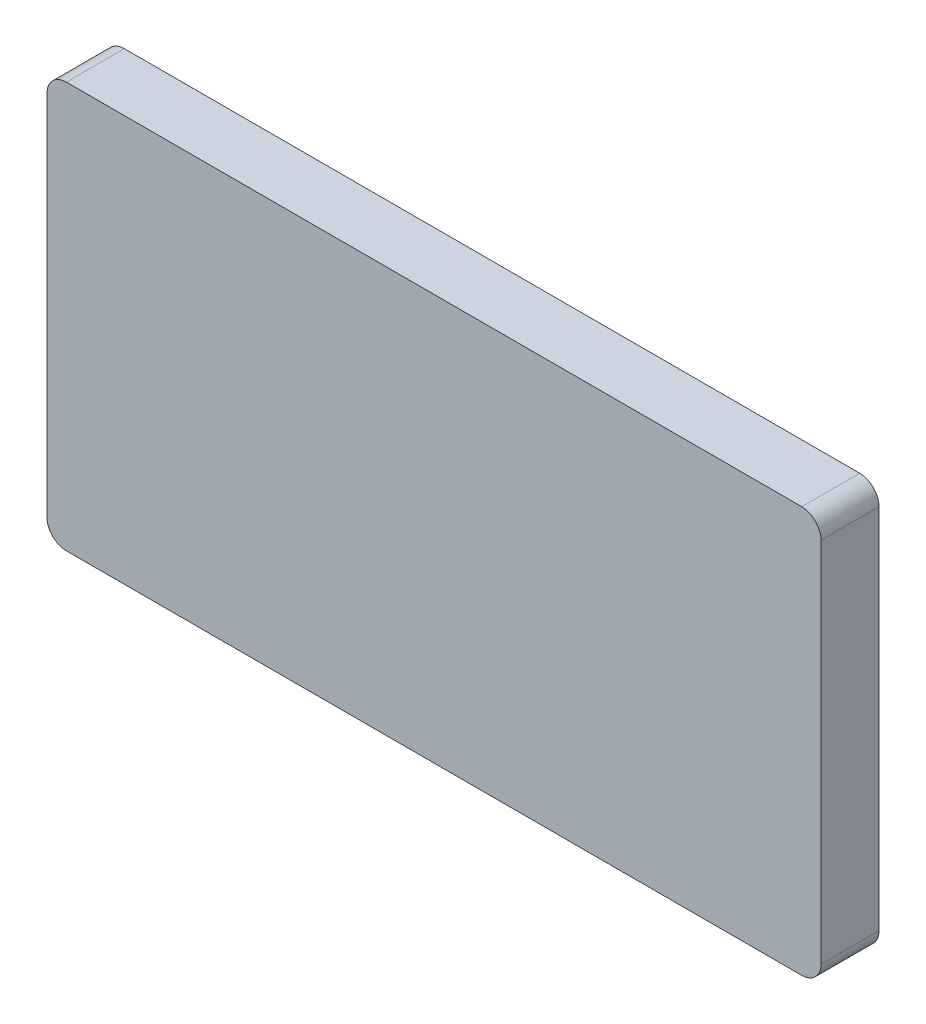
ISO-10303-21;
HEADER;
FILE_DESCRIPTION(('STEP AP214'),'2;1');
FILE_NAME('part.step','',(''),(''),'','','');
FILE_SCHEMA(('AUTOMOTIVE_DESIGN { 1 0 10303 214 1 1 1 1 }'));
ENDSEC;
DATA;
#1=APPLICATION_CONTEXT('core data for automotive mechanical design processes');
#2=APPLICATION_PROTOCOL_DEFINITION('international standard','automotive_design',2000,#1);
#3=PRODUCT_CONTEXT('',#1,'mechanical');
#4=PRODUCT('Part','Part','',(#3));
#5=PRODUCT_RELATED_PRODUCT_CATEGORY('part','',(#4));
#6=PRODUCT_DEFINITION_FORMATION('','',#4);
#7=PRODUCT_DEFINITION_CONTEXT('part definition',#1,'design');
#8=PRODUCT_DEFINITION('design','',#6,#7);
#9=PRODUCT_DEFINITION_SHAPE('','',#8);
#10=(LENGTH_UNIT() NAMED_UNIT(*) SI_UNIT(.MILLI.,.METRE.));
#11=(NAMED_UNIT(*) PLANE_ANGLE_UNIT() SI_UNIT($,.RADIAN.));
#12=(NAMED_UNIT(*) SI_UNIT($,.STERADIAN.) SOLID_ANGLE_UNIT());
#13=UNCERTAINTY_MEASURE_WITH_UNIT(LENGTH_MEASURE(1.E-05),#10,'distance_accuracy_value','');
#14=(GEOMETRIC_REPRESENTATION_CONTEXT(3) GLOBAL_UNCERTAINTY_ASSIGNED_CONTEXT((#13)) GLOBAL_UNIT_ASSIGNED_CONTEXT((#10,
#11,#12)) REPRESENTATION_CONTEXT('',''));
#15=CARTESIAN_POINT('',(0.,0.,0.));
#16=DIRECTION('',(0.,0.,1.));
#17=DIRECTION('',(1.,0.,0.));
#18=AXIS2_PLACEMENT_3D('',#15,#16,#17);
#19=CARTESIAN_POINT('',(-36.,21.,6.));
#20=DIRECTION('',(1.,0.,0.));
#21=DIRECTION('',(0.,1.,0.));
#22=AXIS2_PLACEMENT_3D('',#19,#20,#21);
#23=PLANE('',#22);
#24=DIRECTION('',(0.,-1.,0.));
#25=VECTOR('',#24,1.);
#26=CARTESIAN_POINT('',(-36.,21.,6.));
#27=LINE('',#26,#25);
#28=CARTESIAN_POINT('',(-36.,19.,6.));
#29=VERTEX_POINT('',#28);
#30=CARTESIAN_POINT('',(-36.,-19.,6.));
#31=VERTEX_POINT('',#30);
#32=EDGE_CURVE('E166',#29,#31,#27,.T.);
#33=ORIENTED_EDGE('',*,*,#32,.F.);
#34=DIRECTION('',(0.,0.,-1.));
#35=VECTOR('',#34,1.);
#36=CARTESIAN_POINT('',(-36.,19.,6.));
#37=LINE('',#36,#35);
#38=CARTESIAN_POINT('',(-36.,19.,0.));
#39=VERTEX_POINT('',#38);
#40=EDGE_CURVE('E12',#29,#39,#37,.T.);
#41=ORIENTED_EDGE('',*,*,#40,.T.);
#42=DIRECTION('',(0.,-1.,0.));
#43=VECTOR('',#42,1.);
#44=CARTESIAN_POINT('',(-36.,21.,0.));
#45=LINE('',#44,#43);
#46=CARTESIAN_POINT('',(-36.,-19.,0.));
#47=VERTEX_POINT('',#46);
#48=EDGE_CURVE('E165',#39,#47,#45,.T.);
#49=ORIENTED_EDGE('',*,*,#48,.T.);
#50=DIRECTION('',(0.,0.,-1.));
#51=VECTOR('',#50,1.);
#52=CARTESIAN_POINT('',(-36.,-19.,6.));
#53=LINE('',#52,#51);
#54=EDGE_CURVE('E43',#47,#31,#53,.F.);
#55=ORIENTED_EDGE('',*,*,#54,.T.);
#56=EDGE_LOOP('',(#33,#41,#49,#55));
#57=FACE_BOUND('',#56,.T.);
#58=ADVANCED_FACE('F35',(#57),#23,.F.);
#59=CARTESIAN_POINT('',(-36.,-21.,6.));
#60=DIRECTION('',(0.,1.,0.));
#61=DIRECTION('',(-1.,0.,0.));
#62=AXIS2_PLACEMENT_3D('',#59,#60,#61);
#63=PLANE('',#62);
#64=DIRECTION('',(1.,0.,0.));
#65=VECTOR('',#64,1.);
#66=CARTESIAN_POINT('',(-36.,-21.,0.));
#67=LINE('',#66,#65);
#68=CARTESIAN_POINT('',(-34.,-21.,0.));
#69=VERTEX_POINT('',#68);
#70=CARTESIAN_POINT('',(42.1,-21.,0.));
#71=VERTEX_POINT('',#70);
#72=EDGE_CURVE('E180',#69,#71,#67,.T.);
#73=ORIENTED_EDGE('',*,*,#72,.T.);
#74=DIRECTION('',(0.,0.,-1.));
#75=VECTOR('',#74,1.);
#76=CARTESIAN_POINT('',(42.1,-21.,6.));
#77=LINE('',#76,#75);
#78=CARTESIAN_POINT('',(42.1,-21.,6.));
#79=VERTEX_POINT('',#78);
#80=EDGE_CURVE('E50',#71,#79,#77,.F.);
#81=ORIENTED_EDGE('',*,*,#80,.T.);
#82=DIRECTION('',(1.,0.,0.));
#83=VECTOR('',#82,1.);
#84=CARTESIAN_POINT('',(-36.,-21.,6.));
#85=LINE('',#84,#83);
#86=CARTESIAN_POINT('',(-34.,-21.,6.));
#87=VERTEX_POINT('',#86);
#88=EDGE_CURVE('E168',#87,#79,#85,.T.);
#89=ORIENTED_EDGE('',*,*,#88,.F.);
#90=DIRECTION('',(0.,0.,-1.));
#91=VECTOR('',#90,1.);
#92=CARTESIAN_POINT('',(-34.,-21.,6.));
#93=LINE('',#92,#91);
#94=EDGE_CURVE('E211',#87,#69,#93,.T.);
#95=ORIENTED_EDGE('',*,*,#94,.T.);
#96=EDGE_LOOP('',(#73,#81,#89,#95));
#97=FACE_BOUND('',#96,.T.);
#98=ADVANCED_FACE('F224',(#97),#63,.F.);
#99=CARTESIAN_POINT('',(44.1,21.,6.));
#100=DIRECTION('',(-1.,0.,0.));
#101=DIRECTION('',(0.,-1.,0.));
#102=AXIS2_PLACEMENT_3D('',#99,#100,#101);
#103=PLANE('',#102);
#104=DIRECTION('',(0.,1.,0.));
#105=VECTOR('',#104,1.);
#106=CARTESIAN_POINT('',(44.1,21.,0.));
#107=LINE('',#106,#105);
#108=CARTESIAN_POINT('',(44.1,-19.,0.));
#109=VERTEX_POINT('',#108);
#110=CARTESIAN_POINT('',(44.1,19.,0.));
#111=VERTEX_POINT('',#110);
#112=EDGE_CURVE('E182',#109,#111,#107,.T.);
#113=ORIENTED_EDGE('',*,*,#112,.T.);
#114=DIRECTION('',(0.,0.,-1.));
#115=VECTOR('',#114,1.);
#116=CARTESIAN_POINT('',(44.1,19.,6.));
#117=LINE('',#116,#115);
#118=CARTESIAN_POINT('',(44.1,19.,6.));
#119=VERTEX_POINT('',#118);
#120=EDGE_CURVE('E202',#111,#119,#117,.F.);
#121=ORIENTED_EDGE('',*,*,#120,.T.);
#122=DIRECTION('',(0.,1.,0.));
#123=VECTOR('',#122,1.);
#124=CARTESIAN_POINT('',(44.1,21.,6.));
#125=LINE('',#124,#123);
#126=CARTESIAN_POINT('',(44.1,-19.,6.));
#127=VERTEX_POINT('',#126);
#128=EDGE_CURVE('E171',#127,#119,#125,.T.);
#129=ORIENTED_EDGE('',*,*,#128,.F.);
#130=DIRECTION('',(0.,0.,-1.));
#131=VECTOR('',#130,1.);
#132=CARTESIAN_POINT('',(44.1,-19.,6.));
#133=LINE('',#132,#131);
#134=EDGE_CURVE('E199',#127,#109,#133,.T.);
#135=ORIENTED_EDGE('',*,*,#134,.T.);
#136=EDGE_LOOP('',(#113,#121,#129,#135));
#137=FACE_BOUND('',#136,.T.);
#138=ADVANCED_FACE('F235',(#137),#103,.F.);
#139=CARTESIAN_POINT('',(-36.,21.,6.));
#140=DIRECTION('',(0.,-1.,0.));
#141=DIRECTION('',(0.,0.,-1.));
#142=AXIS2_PLACEMENT_3D('',#139,#140,#141);
#143=PLANE('',#142);
#144=DIRECTION('',(-1.,0.,0.));
#145=VECTOR('',#144,1.);
#146=CARTESIAN_POINT('',(-36.,21.,6.));
#147=LINE('',#146,#145);
#148=CARTESIAN_POINT('',(42.1,21.,6.));
#149=VERTEX_POINT('',#148);
#150=CARTESIAN_POINT('',(-34.,21.,6.));
#151=VERTEX_POINT('',#150);
#152=EDGE_CURVE('E174',#149,#151,#147,.T.);
#153=ORIENTED_EDGE('',*,*,#152,.F.);
#154=DIRECTION('',(0.,0.,-1.));
#155=VECTOR('',#154,1.);
#156=CARTESIAN_POINT('',(42.1,21.,6.));
#157=LINE('',#156,#155);
#158=CARTESIAN_POINT('',(42.1,21.,0.));
#159=VERTEX_POINT('',#158);
#160=EDGE_CURVE('E188',#149,#159,#157,.T.);
#161=ORIENTED_EDGE('',*,*,#160,.T.);
#162=DIRECTION('',(-1.,0.,0.));
#163=VECTOR('',#162,1.);
#164=CARTESIAN_POINT('',(-36.,21.,0.));
#165=LINE('',#164,#163);
#166=CARTESIAN_POINT('',(-34.,21.,0.));
#167=VERTEX_POINT('',#166);
#168=EDGE_CURVE('E169',#159,#167,#165,.T.);
#169=ORIENTED_EDGE('',*,*,#168,.T.);
#170=DIRECTION('',(0.,0.,-1.));
#171=VECTOR('',#170,1.);
#172=CARTESIAN_POINT('',(-34.,21.,6.));
#173=LINE('',#172,#171);
#174=EDGE_CURVE('E177',#167,#151,#173,.F.);
#175=ORIENTED_EDGE('',*,*,#174,.T.);
#176=EDGE_LOOP('',(#153,#161,#169,#175));
#177=FACE_BOUND('',#176,.T.);
#178=ADVANCED_FACE('F243',(#177),#143,.F.);
#179=CARTESIAN_POINT('',(0.,0.,6.));
#180=DIRECTION('',(0.,0.,1.));
#181=DIRECTION('',(1.,0.,0.));
#182=AXIS2_PLACEMENT_3D('',#179,#180,#181);
#183=PLANE('',#182);
#184=ORIENTED_EDGE('',*,*,#128,.T.);
#185=CARTESIAN_POINT('',(42.1,19.,6.));
#186=DIRECTION('',(0.,0.,1.));
#187=DIRECTION('',(1.,0.,0.));
#188=AXIS2_PLACEMENT_3D('',#185,#186,#187);
#189=CIRCLE('',#188,2.);
#190=EDGE_CURVE('E209',#119,#149,#189,.T.);
#191=ORIENTED_EDGE('',*,*,#190,.T.);
#192=ORIENTED_EDGE('',*,*,#152,.T.);
#193=CARTESIAN_POINT('',(-34.,19.,6.));
#194=DIRECTION('',(0.,0.,1.));
#195=DIRECTION('',(1.,0.,0.));
#196=AXIS2_PLACEMENT_3D('',#193,#194,#195);
#197=CIRCLE('',#196,2.);
#198=EDGE_CURVE('E205',#151,#29,#197,.T.);
#199=ORIENTED_EDGE('',*,*,#198,.T.);
#200=ORIENTED_EDGE('',*,*,#32,.T.);
#201=CARTESIAN_POINT('',(-34.,-19.,6.));
#202=DIRECTION('',(0.,0.,1.));
#203=DIRECTION('',(1.,0.,0.));
#204=AXIS2_PLACEMENT_3D('',#201,#202,#203);
#205=CIRCLE('',#204,2.);
#206=EDGE_CURVE('E57',#31,#87,#205,.T.);
#207=ORIENTED_EDGE('',*,*,#206,.T.);
#208=ORIENTED_EDGE('',*,*,#88,.T.);
#209=CARTESIAN_POINT('',(42.1,-19.,6.));
#210=DIRECTION('',(0.,0.,1.));
#211=DIRECTION('',(1.,0.,0.));
#212=AXIS2_PLACEMENT_3D('',#209,#210,#211);
#213=CIRCLE('',#212,2.);
#214=EDGE_CURVE('E207',#79,#127,#213,.T.);
#215=ORIENTED_EDGE('',*,*,#214,.T.);
#216=EDGE_LOOP('',(#184,#191,#192,#199,#200,#207,#208,#215));
#217=FACE_BOUND('',#216,.T.);
#218=ADVANCED_FACE('F220',(#217),#183,.T.);
#219=CARTESIAN_POINT('',(0.,0.,0.));
#220=DIRECTION('',(0.,0.,1.));
#221=DIRECTION('',(1.,0.,0.));
#222=AXIS2_PLACEMENT_3D('',#219,#220,#221);
#223=PLANE('',#222);
#224=DIRECTION('',(1.,0.,0.));
#225=VECTOR('',#224,1.);
#226=CARTESIAN_POINT('',(-34.,19.,0.));
#227=LINE('',#226,#225);
#228=CARTESIAN_POINT('',(-34.,19.,0.));
#229=VERTEX_POINT('',#228);
#230=CARTESIAN_POINT('',(42.1,19.,0.));
#231=VERTEX_POINT('',#230);
#232=EDGE_CURVE('E150',#229,#231,#227,.T.);
#233=ORIENTED_EDGE('',*,*,#232,.F.);
#234=DIRECTION('',(0.,1.,0.));
#235=VECTOR('',#234,1.);
#236=CARTESIAN_POINT('',(-34.,-19.,0.));
#237=LINE('',#236,#235);
#238=CARTESIAN_POINT('',(-34.,-19.,0.));
#239=VERTEX_POINT('',#238);
#240=EDGE_CURVE('E142',#239,#229,#237,.T.);
#241=ORIENTED_EDGE('',*,*,#240,.F.);
#242=DIRECTION('',(-1.,0.,0.));
#243=VECTOR('',#242,1.);
#244=CARTESIAN_POINT('',(42.1,-19.,0.));
#245=LINE('',#244,#243);
#246=CARTESIAN_POINT('',(42.1,-19.,0.));
#247=VERTEX_POINT('',#246);
#248=EDGE_CURVE('E154',#247,#239,#245,.T.);
#249=ORIENTED_EDGE('',*,*,#248,.F.);
#250=DIRECTION('',(0.,-1.,0.));
#251=VECTOR('',#250,1.);
#252=CARTESIAN_POINT('',(42.1,19.,0.));
#253=LINE('',#252,#251);
#254=EDGE_CURVE('E148',#231,#247,#253,.T.);
#255=ORIENTED_EDGE('',*,*,#254,.F.);
#256=EDGE_LOOP('',(#233,#241,#249,#255));
#257=FACE_BOUND('',#256,.T.);
#258=ORIENTED_EDGE('',*,*,#168,.F.);
#259=CARTESIAN_POINT('',(42.1,19.,0.));
#260=DIRECTION('',(0.,0.,1.));
#261=DIRECTION('',(1.,0.,0.));
#262=AXIS2_PLACEMENT_3D('',#259,#260,#261);
#263=CIRCLE('',#262,2.);
#264=EDGE_CURVE('E197',#159,#111,#263,.F.);
#265=ORIENTED_EDGE('',*,*,#264,.T.);
#266=ORIENTED_EDGE('',*,*,#112,.F.);
#267=CARTESIAN_POINT('',(42.1,-19.,0.));
#268=DIRECTION('',(0.,0.,1.));
#269=DIRECTION('',(1.,0.,0.));
#270=AXIS2_PLACEMENT_3D('',#267,#268,#269);
#271=CIRCLE('',#270,2.);
#272=EDGE_CURVE('E195',#109,#71,#271,.F.);
#273=ORIENTED_EDGE('',*,*,#272,.T.);
#274=ORIENTED_EDGE('',*,*,#72,.F.);
#275=CARTESIAN_POINT('',(-34.,-19.,0.));
#276=DIRECTION('',(0.,0.,1.));
#277=DIRECTION('',(1.,0.,0.));
#278=AXIS2_PLACEMENT_3D('',#275,#276,#277);
#279=CIRCLE('',#278,2.);
#280=EDGE_CURVE('E191',#69,#47,#279,.F.);
#281=ORIENTED_EDGE('',*,*,#280,.T.);
#282=ORIENTED_EDGE('',*,*,#48,.F.);
#283=CARTESIAN_POINT('',(-34.,19.,0.));
#284=DIRECTION('',(0.,0.,1.));
#285=DIRECTION('',(1.,0.,0.));
#286=AXIS2_PLACEMENT_3D('',#283,#284,#285);
#287=CIRCLE('',#286,2.);
#288=EDGE_CURVE('E193',#39,#167,#287,.F.);
#289=ORIENTED_EDGE('',*,*,#288,.T.);
#290=EDGE_LOOP('',(#258,#265,#266,#273,#274,#281,#282,#289));
#291=FACE_BOUND('',#290,.T.);
#292=ADVANCED_FACE('F227',(#257,#291),#223,.F.);
#293=CARTESIAN_POINT('',(0.,0.,5.4));
#294=DIRECTION('',(0.,0.,1.));
#295=DIRECTION('',(1.,0.,0.));
#296=AXIS2_PLACEMENT_3D('',#293,#294,#295);
#297=PLANE('',#296);
#298=DIRECTION('',(-1.,0.,0.));
#299=VECTOR('',#298,1.);
#300=CARTESIAN_POINT('',(42.1,-19.,5.4));
#301=LINE('',#300,#299);
#302=CARTESIAN_POINT('',(42.1,-19.,5.4));
#303=VERTEX_POINT('',#302);
#304=CARTESIAN_POINT('',(-34.,-19.,5.4));
#305=VERTEX_POINT('',#304);
#306=EDGE_CURVE('E146',#303,#305,#301,.T.);
#307=ORIENTED_EDGE('',*,*,#306,.T.);
#308=DIRECTION('',(0.,1.,0.));
#309=VECTOR('',#308,1.);
#310=CARTESIAN_POINT('',(-34.,-19.,5.4));
#311=LINE('',#310,#309);
#312=CARTESIAN_POINT('',(-34.,19.,5.4));
#313=VERTEX_POINT('',#312);
#314=EDGE_CURVE('E139',#305,#313,#311,.T.);
#315=ORIENTED_EDGE('',*,*,#314,.T.);
#316=DIRECTION('',(1.,0.,0.));
#317=VECTOR('',#316,1.);
#318=CARTESIAN_POINT('',(-34.,19.,5.4));
#319=LINE('',#318,#317);
#320=CARTESIAN_POINT('',(42.1,19.,5.4));
#321=VERTEX_POINT('',#320);
#322=EDGE_CURVE('E126',#313,#321,#319,.T.);
#323=ORIENTED_EDGE('',*,*,#322,.T.);
#324=DIRECTION('',(0.,-1.,0.));
#325=VECTOR('',#324,1.);
#326=CARTESIAN_POINT('',(42.1,19.,5.4));
#327=LINE('',#326,#325);
#328=EDGE_CURVE('E159',#321,#303,#327,.T.);
#329=ORIENTED_EDGE('',*,*,#328,.T.);
#330=EDGE_LOOP('',(#307,#315,#323,#329));
#331=FACE_BOUND('',#330,.T.);
#332=ADVANCED_FACE('F145',(#331),#297,.F.);
#333=CARTESIAN_POINT('',(-34.,-19.,91.0600376204949));
#334=DIRECTION('',(-1.,0.,0.));
#335=DIRECTION('',(0.,-1.,0.));
#336=AXIS2_PLACEMENT_3D('',#333,#334,#335);
#337=PLANE('',#336);
#338=DIRECTION('',(0.,0.,-1.));
#339=VECTOR('',#338,1.);
#340=CARTESIAN_POINT('',(-34.,-19.,91.0600376204949));
#341=LINE('',#340,#339);
#342=EDGE_CURVE('E157',#305,#239,#341,.T.);
#343=ORIENTED_EDGE('',*,*,#342,.T.);
#344=ORIENTED_EDGE('',*,*,#240,.T.);
#345=DIRECTION('',(0.,0.,-1.));
#346=VECTOR('',#345,1.);
#347=CARTESIAN_POINT('',(-34.,19.,91.0600376204949));
#348=LINE('',#347,#346);
#349=EDGE_CURVE('E130',#313,#229,#348,.T.);
#350=ORIENTED_EDGE('',*,*,#349,.F.);
#351=ORIENTED_EDGE('',*,*,#314,.F.);
#352=EDGE_LOOP('',(#343,#344,#350,#351));
#353=FACE_BOUND('',#352,.T.);
#354=ADVANCED_FACE('F138',(#353),#337,.F.);
#355=CARTESIAN_POINT('',(-34.,19.,91.0600376204949));
#356=DIRECTION('',(0.,1.,0.));
#357=DIRECTION('',(0.,0.,1.));
#358=AXIS2_PLACEMENT_3D('',#355,#356,#357);
#359=PLANE('',#358);
#360=ORIENTED_EDGE('',*,*,#349,.T.);
#361=ORIENTED_EDGE('',*,*,#232,.T.);
#362=DIRECTION('',(0.,0.,-1.));
#363=VECTOR('',#362,1.);
#364=CARTESIAN_POINT('',(42.1,19.,91.0600376204949));
#365=LINE('',#364,#363);
#366=EDGE_CURVE('E132',#321,#231,#365,.T.);
#367=ORIENTED_EDGE('',*,*,#366,.F.);
#368=ORIENTED_EDGE('',*,*,#322,.F.);
#369=EDGE_LOOP('',(#360,#361,#367,#368));
#370=FACE_BOUND('',#369,.T.);
#371=ADVANCED_FACE('F128',(#370),#359,.F.);
#372=CARTESIAN_POINT('',(42.1,19.,91.0600376204949));
#373=DIRECTION('',(1.,0.,0.));
#374=DIRECTION('',(0.,1.,0.));
#375=AXIS2_PLACEMENT_3D('',#372,#373,#374);
#376=PLANE('',#375);
#377=ORIENTED_EDGE('',*,*,#366,.T.);
#378=ORIENTED_EDGE('',*,*,#254,.T.);
#379=DIRECTION('',(0.,0.,-1.));
#380=VECTOR('',#379,1.);
#381=CARTESIAN_POINT('',(42.1,-19.,91.0600376204949));
#382=LINE('',#381,#380);
#383=EDGE_CURVE('E158',#303,#247,#382,.T.);
#384=ORIENTED_EDGE('',*,*,#383,.F.);
#385=ORIENTED_EDGE('',*,*,#328,.F.);
#386=EDGE_LOOP('',(#377,#378,#384,#385));
#387=FACE_BOUND('',#386,.T.);
#388=ADVANCED_FACE('F266',(#387),#376,.F.);
#389=CARTESIAN_POINT('',(42.1,-19.,91.0600376204949));
#390=DIRECTION('',(0.,-1.,0.));
#391=DIRECTION('',(1.,0.,0.));
#392=AXIS2_PLACEMENT_3D('',#389,#390,#391);
#393=PLANE('',#392);
#394=ORIENTED_EDGE('',*,*,#383,.T.);
#395=ORIENTED_EDGE('',*,*,#248,.T.);
#396=ORIENTED_EDGE('',*,*,#342,.F.);
#397=ORIENTED_EDGE('',*,*,#306,.F.);
#398=EDGE_LOOP('',(#394,#395,#396,#397));
#399=FACE_BOUND('',#398,.T.);
#400=ADVANCED_FACE('F262',(#399),#393,.F.);
#401=CARTESIAN_POINT('',(42.1,19.,6.));
#402=DIRECTION('',(0.,0.,-1.));
#403=DIRECTION('',(-1.,0.,0.));
#404=AXIS2_PLACEMENT_3D('',#401,#402,#403);
#405=CYLINDRICAL_SURFACE('',#404,2.);
#406=ORIENTED_EDGE('',*,*,#190,.F.);
#407=ORIENTED_EDGE('',*,*,#120,.F.);
#408=ORIENTED_EDGE('',*,*,#264,.F.);
#409=ORIENTED_EDGE('',*,*,#160,.F.);
#410=EDGE_LOOP('',(#406,#407,#408,#409));
#411=FACE_BOUND('',#410,.T.);
#412=ADVANCED_FACE('F241',(#411),#405,.T.);
#413=CARTESIAN_POINT('',(42.1,-19.,6.));
#414=DIRECTION('',(0.,0.,-1.));
#415=DIRECTION('',(-1.,0.,0.));
#416=AXIS2_PLACEMENT_3D('',#413,#414,#415);
#417=CYLINDRICAL_SURFACE('',#416,2.);
#418=ORIENTED_EDGE('',*,*,#214,.F.);
#419=ORIENTED_EDGE('',*,*,#80,.F.);
#420=ORIENTED_EDGE('',*,*,#272,.F.);
#421=ORIENTED_EDGE('',*,*,#134,.F.);
#422=EDGE_LOOP('',(#418,#419,#420,#421));
#423=FACE_BOUND('',#422,.T.);
#424=ADVANCED_FACE('F232',(#423),#417,.T.);
#425=CARTESIAN_POINT('',(-34.,19.,6.));
#426=DIRECTION('',(0.,0.,-1.));
#427=DIRECTION('',(-1.,0.,0.));
#428=AXIS2_PLACEMENT_3D('',#425,#426,#427);
#429=CYLINDRICAL_SURFACE('',#428,2.);
#430=ORIENTED_EDGE('',*,*,#198,.F.);
#431=ORIENTED_EDGE('',*,*,#174,.F.);
#432=ORIENTED_EDGE('',*,*,#288,.F.);
#433=ORIENTED_EDGE('',*,*,#40,.F.);
#434=EDGE_LOOP('',(#430,#431,#432,#433));
#435=FACE_BOUND('',#434,.T.);
#436=ADVANCED_FACE('F246',(#435),#429,.T.);
#437=CARTESIAN_POINT('',(-34.,-19.,6.));
#438=DIRECTION('',(0.,0.,-1.));
#439=DIRECTION('',(-1.,0.,0.));
#440=AXIS2_PLACEMENT_3D('',#437,#438,#439);
#441=CYLINDRICAL_SURFACE('',#440,2.);
#442=ORIENTED_EDGE('',*,*,#206,.F.);
#443=ORIENTED_EDGE('',*,*,#54,.F.);
#444=ORIENTED_EDGE('',*,*,#280,.F.);
#445=ORIENTED_EDGE('',*,*,#94,.F.);
#446=EDGE_LOOP('',(#442,#443,#444,#445));
#447=FACE_BOUND('',#446,.T.);
#448=ADVANCED_FACE('F37',(#447),#441,.T.);
#449=CLOSED_SHELL('',(#58,#98,#138,#178,#218,#292,#332,#354,#371,#388,#400,#412,#424,#436,#448));
#450=MANIFOLD_SOLID_BREP('B2',#449);
#451=ADVANCED_BREP_SHAPE_REPRESENTATION('',(#18,#450),#14);
#452=SHAPE_DEFINITION_REPRESENTATION(#9,#451);
ENDSEC;
END-ISO-10303-21;
